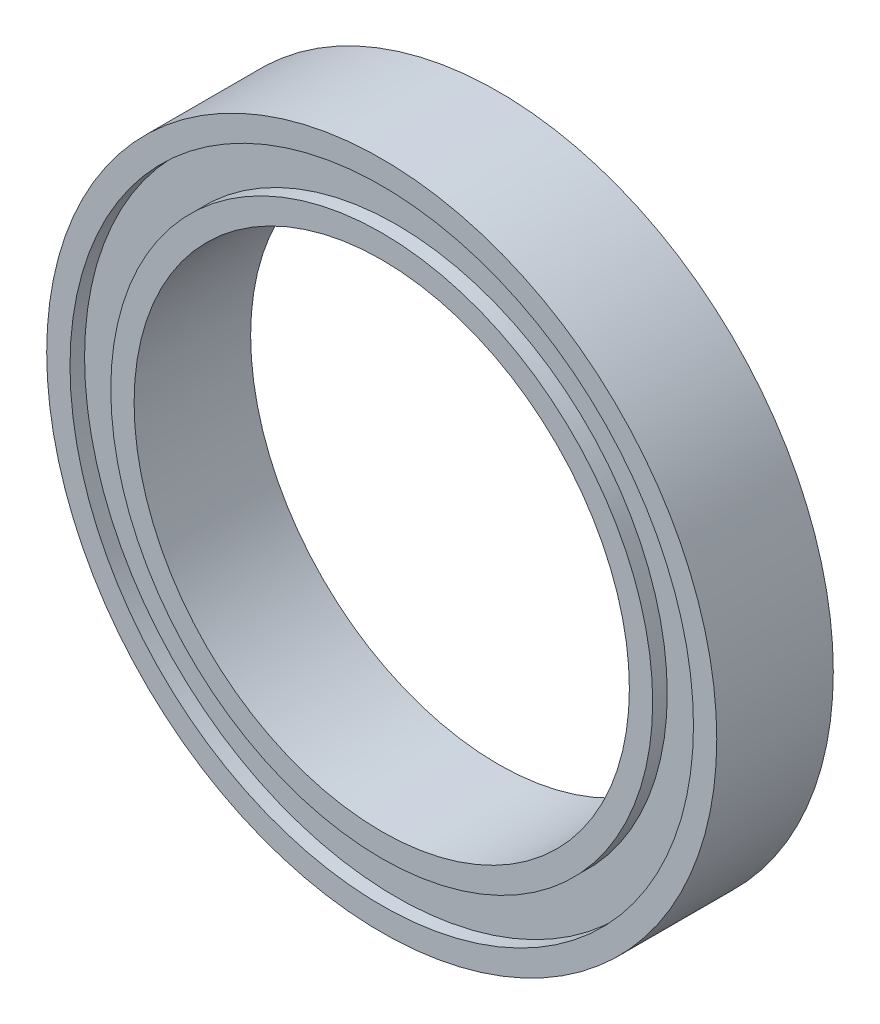
ISO-10303-21;
HEADER;
FILE_DESCRIPTION(('STEP AP214'),'2;1');
FILE_NAME('part.step','',(''),(''),'','','');
FILE_SCHEMA(('AUTOMOTIVE_DESIGN { 1 0 10303 214 1 1 1 1 }'));
ENDSEC;
DATA;
#1=APPLICATION_CONTEXT('core data for automotive mechanical design processes');
#2=APPLICATION_PROTOCOL_DEFINITION('international standard','automotive_design',2000,#1);
#3=PRODUCT_CONTEXT('',#1,'mechanical');
#4=PRODUCT('Part','Part','',(#3));
#5=PRODUCT_RELATED_PRODUCT_CATEGORY('part','',(#4));
#6=PRODUCT_DEFINITION_FORMATION('','',#4);
#7=PRODUCT_DEFINITION_CONTEXT('part definition',#1,'design');
#8=PRODUCT_DEFINITION('design','',#6,#7);
#9=PRODUCT_DEFINITION_SHAPE('','',#8);
#10=(LENGTH_UNIT() NAMED_UNIT(*) SI_UNIT(.MILLI.,.METRE.));
#11=(NAMED_UNIT(*) PLANE_ANGLE_UNIT() SI_UNIT($,.RADIAN.));
#12=(NAMED_UNIT(*) SI_UNIT($,.STERADIAN.) SOLID_ANGLE_UNIT());
#13=UNCERTAINTY_MEASURE_WITH_UNIT(LENGTH_MEASURE(1.E-05),#10,'distance_accuracy_value','');
#14=(GEOMETRIC_REPRESENTATION_CONTEXT(3) GLOBAL_UNCERTAINTY_ASSIGNED_CONTEXT((#13)) GLOBAL_UNIT_ASSIGNED_CONTEXT((#10,
#11,#12)) REPRESENTATION_CONTEXT('',''));
#15=CARTESIAN_POINT('',(0.,0.,0.));
#16=DIRECTION('',(0.,0.,1.));
#17=DIRECTION('',(1.,0.,0.));
#18=AXIS2_PLACEMENT_3D('',#15,#16,#17);
#19=CARTESIAN_POINT('',(0.,0.,0.));
#20=DIRECTION('',(0.,0.,1.));
#21=DIRECTION('',(1.,0.,0.));
#22=AXIS2_PLACEMENT_3D('',#19,#20,#21);
#23=PLANE('',#22);
#24=CARTESIAN_POINT('',(0.,0.,0.));
#25=DIRECTION('',(0.,0.,1.));
#26=DIRECTION('',(1.,0.,0.));
#27=AXIS2_PLACEMENT_3D('',#24,#25,#26);
#28=CIRCLE('',#27,8.5);
#29=CARTESIAN_POINT('',(8.5,0.,0.));
#30=VERTEX_POINT('',#29);
#31=EDGE_CURVE('E55',#30,#30,#28,.T.);
#32=ORIENTED_EDGE('',*,*,#31,.T.);
#33=EDGE_LOOP('',(#32));
#34=FACE_BOUND('',#33,.T.);
#35=CARTESIAN_POINT('',(0.,0.,0.));
#36=DIRECTION('',(0.,0.,-1.));
#37=DIRECTION('',(-1.,0.,0.));
#38=AXIS2_PLACEMENT_3D('',#35,#36,#37);
#39=CIRCLE('',#38,9.3);
#40=CARTESIAN_POINT('',(-9.3,0.,0.));
#41=VERTEX_POINT('',#40);
#42=EDGE_CURVE('E79',#41,#41,#39,.T.);
#43=ORIENTED_EDGE('',*,*,#42,.T.);
#44=EDGE_LOOP('',(#43));
#45=FACE_BOUND('',#44,.T.);
#46=ADVANCED_FACE('F42',(#34,#45),#23,.F.);
#47=CARTESIAN_POINT('',(0.,0.,4.));
#48=DIRECTION('',(0.,0.,1.));
#49=DIRECTION('',(1.,0.,0.));
#50=AXIS2_PLACEMENT_3D('',#47,#48,#49);
#51=PLANE('',#50);
#52=CARTESIAN_POINT('',(0.,0.,4.));
#53=DIRECTION('',(0.,0.,1.));
#54=DIRECTION('',(1.,0.,0.));
#55=AXIS2_PLACEMENT_3D('',#52,#53,#54);
#56=CIRCLE('',#55,8.5);
#57=CARTESIAN_POINT('',(8.5,0.,4.));
#58=VERTEX_POINT('',#57);
#59=EDGE_CURVE('E53',#58,#58,#56,.T.);
#60=ORIENTED_EDGE('',*,*,#59,.F.);
#61=EDGE_LOOP('',(#60));
#62=FACE_BOUND('',#61,.T.);
#63=CARTESIAN_POINT('',(0.,0.,4.));
#64=DIRECTION('',(0.,0.,1.));
#65=DIRECTION('',(1.,0.,0.));
#66=AXIS2_PLACEMENT_3D('',#63,#64,#65);
#67=CIRCLE('',#66,9.3);
#68=CARTESIAN_POINT('',(9.3,0.,4.));
#69=VERTEX_POINT('',#68);
#70=EDGE_CURVE('E67',#69,#69,#67,.T.);
#71=ORIENTED_EDGE('',*,*,#70,.T.);
#72=EDGE_LOOP('',(#71));
#73=FACE_BOUND('',#72,.T.);
#74=ADVANCED_FACE('F117',(#62,#73),#51,.T.);
#75=CARTESIAN_POINT('',(0.,0.,4.));
#76=DIRECTION('',(0.,0.,1.));
#77=DIRECTION('',(1.,0.,0.));
#78=AXIS2_PLACEMENT_3D('',#75,#76,#77);
#79=CIRCLE('',#78,10.7);
#80=CARTESIAN_POINT('',(10.7,0.,4.));
#81=VERTEX_POINT('',#80);
#82=EDGE_CURVE('E61',#81,#81,#79,.T.);
#83=ORIENTED_EDGE('',*,*,#82,.F.);
#84=EDGE_LOOP('',(#83));
#85=FACE_BOUND('',#84,.T.);
#86=CARTESIAN_POINT('',(0.,0.,4.));
#87=DIRECTION('',(0.,0.,1.));
#88=DIRECTION('',(1.,0.,0.));
#89=AXIS2_PLACEMENT_3D('',#86,#87,#88);
#90=CIRCLE('',#89,11.5);
#91=CARTESIAN_POINT('',(11.5,0.,4.));
#92=VERTEX_POINT('',#91);
#93=EDGE_CURVE('E10',#92,#92,#90,.T.);
#94=ORIENTED_EDGE('',*,*,#93,.T.);
#95=EDGE_LOOP('',(#94));
#96=FACE_BOUND('',#95,.T.);
#97=ADVANCED_FACE('F104',(#85,#96),#51,.T.);
#98=CARTESIAN_POINT('',(0.,0.,0.));
#99=DIRECTION('',(0.,0.,-1.));
#100=DIRECTION('',(-1.,0.,0.));
#101=AXIS2_PLACEMENT_3D('',#98,#99,#100);
#102=CIRCLE('',#101,10.7);
#103=CARTESIAN_POINT('',(-10.7,0.,0.));
#104=VERTEX_POINT('',#103);
#105=EDGE_CURVE('E73',#104,#104,#102,.T.);
#106=ORIENTED_EDGE('',*,*,#105,.F.);
#107=EDGE_LOOP('',(#106));
#108=FACE_BOUND('',#107,.T.);
#109=CARTESIAN_POINT('',(0.,0.,0.));
#110=DIRECTION('',(0.,0.,1.));
#111=DIRECTION('',(1.,0.,0.));
#112=AXIS2_PLACEMENT_3D('',#109,#110,#111);
#113=CIRCLE('',#112,11.5);
#114=CARTESIAN_POINT('',(11.5,0.,0.));
#115=VERTEX_POINT('',#114);
#116=EDGE_CURVE('E46',#115,#115,#113,.T.);
#117=ORIENTED_EDGE('',*,*,#116,.F.);
#118=EDGE_LOOP('',(#117));
#119=FACE_BOUND('',#118,.T.);
#120=ADVANCED_FACE('F101',(#108,#119),#23,.F.);
#121=CARTESIAN_POINT('',(0.,0.,4.));
#122=DIRECTION('',(0.,0.,-1.));
#123=DIRECTION('',(-1.,0.,0.));
#124=AXIS2_PLACEMENT_3D('',#121,#122,#123);
#125=CYLINDRICAL_SURFACE('',#124,11.5);
#126=ORIENTED_EDGE('',*,*,#93,.F.);
#127=EDGE_LOOP('',(#126));
#128=FACE_BOUND('',#127,.T.);
#129=ORIENTED_EDGE('',*,*,#116,.T.);
#130=EDGE_LOOP('',(#129));
#131=FACE_BOUND('',#130,.T.);
#132=ADVANCED_FACE('F44',(#128,#131),#125,.T.);
#133=CARTESIAN_POINT('',(0.,0.,4.));
#134=DIRECTION('',(0.,0.,-1.));
#135=DIRECTION('',(-1.,0.,0.));
#136=AXIS2_PLACEMENT_3D('',#133,#134,#135);
#137=CYLINDRICAL_SURFACE('',#136,8.5);
#138=ORIENTED_EDGE('',*,*,#59,.T.);
#139=EDGE_LOOP('',(#138));
#140=FACE_BOUND('',#139,.T.);
#141=ORIENTED_EDGE('',*,*,#31,.F.);
#142=EDGE_LOOP('',(#141));
#143=FACE_BOUND('',#142,.T.);
#144=ADVANCED_FACE('F108',(#140,#143),#137,.F.);
#145=CARTESIAN_POINT('',(0.,0.,3.5));
#146=DIRECTION('',(0.,0.,1.));
#147=DIRECTION('',(1.,0.,0.));
#148=AXIS2_PLACEMENT_3D('',#145,#146,#147);
#149=CYLINDRICAL_SURFACE('',#148,10.7);
#150=CARTESIAN_POINT('',(0.,0.,3.5));
#151=DIRECTION('',(0.,0.,1.));
#152=DIRECTION('',(1.,0.,0.));
#153=AXIS2_PLACEMENT_3D('',#150,#151,#152);
#154=CIRCLE('',#153,10.7);
#155=CARTESIAN_POINT('',(10.7,0.,3.5));
#156=VERTEX_POINT('',#155);
#157=EDGE_CURVE('E58',#156,#156,#154,.T.);
#158=ORIENTED_EDGE('',*,*,#157,.F.);
#159=EDGE_LOOP('',(#158));
#160=FACE_BOUND('',#159,.T.);
#161=ORIENTED_EDGE('',*,*,#82,.T.);
#162=EDGE_LOOP('',(#161));
#163=FACE_BOUND('',#162,.T.);
#164=ADVANCED_FACE('F113',(#160,#163),#149,.F.);
#165=CARTESIAN_POINT('',(0.,0.,3.5));
#166=DIRECTION('',(0.,0.,1.));
#167=DIRECTION('',(1.,0.,0.));
#168=AXIS2_PLACEMENT_3D('',#165,#166,#167);
#169=PLANE('',#168);
#170=CARTESIAN_POINT('',(0.,0.,3.5));
#171=DIRECTION('',(0.,0.,1.));
#172=DIRECTION('',(1.,0.,0.));
#173=AXIS2_PLACEMENT_3D('',#170,#171,#172);
#174=CIRCLE('',#173,9.3);
#175=CARTESIAN_POINT('',(9.3,0.,3.5));
#176=VERTEX_POINT('',#175);
#177=EDGE_CURVE('E64',#176,#176,#174,.T.);
#178=ORIENTED_EDGE('',*,*,#177,.F.);
#179=EDGE_LOOP('',(#178));
#180=FACE_BOUND('',#179,.T.);
#181=ORIENTED_EDGE('',*,*,#157,.T.);
#182=EDGE_LOOP('',(#181));
#183=FACE_BOUND('',#182,.T.);
#184=ADVANCED_FACE('F130',(#180,#183),#169,.T.);
#185=CARTESIAN_POINT('',(0.,0.,3.5));
#186=DIRECTION('',(0.,0.,1.));
#187=DIRECTION('',(1.,0.,0.));
#188=AXIS2_PLACEMENT_3D('',#185,#186,#187);
#189=CYLINDRICAL_SURFACE('',#188,9.3);
#190=ORIENTED_EDGE('',*,*,#177,.T.);
#191=EDGE_LOOP('',(#190));
#192=FACE_BOUND('',#191,.T.);
#193=ORIENTED_EDGE('',*,*,#70,.F.);
#194=EDGE_LOOP('',(#193));
#195=FACE_BOUND('',#194,.T.);
#196=ADVANCED_FACE('F97',(#192,#195),#189,.T.);
#197=CARTESIAN_POINT('',(0.,0.,0.5));
#198=DIRECTION('',(0.,0.,-1.));
#199=DIRECTION('',(-1.,0.,0.));
#200=AXIS2_PLACEMENT_3D('',#197,#198,#199);
#201=CYLINDRICAL_SURFACE('',#200,10.7);
#202=CARTESIAN_POINT('',(0.,0.,0.5));
#203=DIRECTION('',(0.,0.,-1.));
#204=DIRECTION('',(-1.,0.,0.));
#205=AXIS2_PLACEMENT_3D('',#202,#203,#204);
#206=CIRCLE('',#205,10.7);
#207=CARTESIAN_POINT('',(-10.7,0.,0.5));
#208=VERTEX_POINT('',#207);
#209=EDGE_CURVE('E70',#208,#208,#206,.T.);
#210=ORIENTED_EDGE('',*,*,#209,.F.);
#211=EDGE_LOOP('',(#210));
#212=FACE_BOUND('',#211,.T.);
#213=ORIENTED_EDGE('',*,*,#105,.T.);
#214=EDGE_LOOP('',(#213));
#215=FACE_BOUND('',#214,.T.);
#216=ADVANCED_FACE('F91',(#212,#215),#201,.F.);
#217=CARTESIAN_POINT('',(0.,0.,0.5));
#218=DIRECTION('',(0.,0.,-1.));
#219=DIRECTION('',(-1.,0.,0.));
#220=AXIS2_PLACEMENT_3D('',#217,#218,#219);
#221=PLANE('',#220);
#222=CARTESIAN_POINT('',(0.,0.,0.5));
#223=DIRECTION('',(0.,0.,-1.));
#224=DIRECTION('',(-1.,0.,0.));
#225=AXIS2_PLACEMENT_3D('',#222,#223,#224);
#226=CIRCLE('',#225,9.3);
#227=CARTESIAN_POINT('',(-9.3,0.,0.5));
#228=VERTEX_POINT('',#227);
#229=EDGE_CURVE('E76',#228,#228,#226,.T.);
#230=ORIENTED_EDGE('',*,*,#229,.F.);
#231=EDGE_LOOP('',(#230));
#232=FACE_BOUND('',#231,.T.);
#233=ORIENTED_EDGE('',*,*,#209,.T.);
#234=EDGE_LOOP('',(#233));
#235=FACE_BOUND('',#234,.T.);
#236=ADVANCED_FACE('F88',(#232,#235),#221,.T.);
#237=CARTESIAN_POINT('',(0.,0.,0.5));
#238=DIRECTION('',(0.,0.,-1.));
#239=DIRECTION('',(-1.,0.,0.));
#240=AXIS2_PLACEMENT_3D('',#237,#238,#239);
#241=CYLINDRICAL_SURFACE('',#240,9.3);
#242=ORIENTED_EDGE('',*,*,#229,.T.);
#243=EDGE_LOOP('',(#242));
#244=FACE_BOUND('',#243,.T.);
#245=ORIENTED_EDGE('',*,*,#42,.F.);
#246=EDGE_LOOP('',(#245));
#247=FACE_BOUND('',#246,.T.);
#248=ADVANCED_FACE('F85',(#244,#247),#241,.T.);
#249=CLOSED_SHELL('',(#46,#74,#97,#120,#132,#144,#164,#184,#196,#216,#236,#248));
#250=MANIFOLD_SOLID_BREP('B2',#249);
#251=ADVANCED_BREP_SHAPE_REPRESENTATION('',(#18,#250),#14);
#252=SHAPE_DEFINITION_REPRESENTATION(#9,#251);
ENDSEC;
END-ISO-10303-21;
